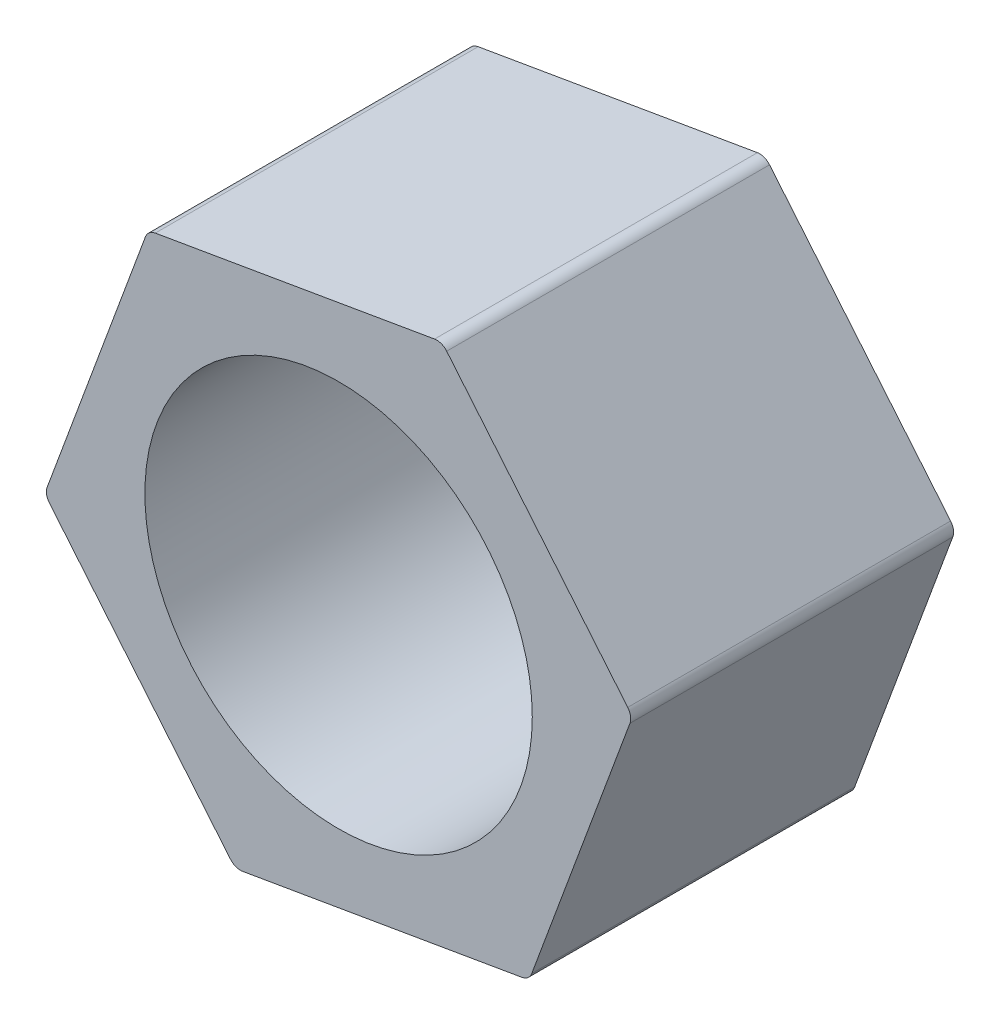
ISO-10303-21;
HEADER;
FILE_DESCRIPTION(('STEP AP214'),'2;1');
FILE_NAME('part.step','',(''),(''),'','','');
FILE_SCHEMA(('AUTOMOTIVE_DESIGN { 1 0 10303 214 1 1 1 1 }'));
ENDSEC;
DATA;
#1=APPLICATION_CONTEXT('core data for automotive mechanical design processes');
#2=APPLICATION_PROTOCOL_DEFINITION('international standard','automotive_design',2000,#1);
#3=PRODUCT_CONTEXT('',#1,'mechanical');
#4=PRODUCT('Part','Part','',(#3));
#5=PRODUCT_RELATED_PRODUCT_CATEGORY('part','',(#4));
#6=PRODUCT_DEFINITION_FORMATION('','',#4);
#7=PRODUCT_DEFINITION_CONTEXT('part definition',#1,'design');
#8=PRODUCT_DEFINITION('design','',#6,#7);
#9=PRODUCT_DEFINITION_SHAPE('','',#8);
#10=(LENGTH_UNIT() NAMED_UNIT(*) SI_UNIT(.MILLI.,.METRE.));
#11=(NAMED_UNIT(*) PLANE_ANGLE_UNIT() SI_UNIT($,.RADIAN.));
#12=(NAMED_UNIT(*) SI_UNIT($,.STERADIAN.) SOLID_ANGLE_UNIT());
#13=UNCERTAINTY_MEASURE_WITH_UNIT(LENGTH_MEASURE(1.E-05),#10,'distance_accuracy_value','');
#14=(GEOMETRIC_REPRESENTATION_CONTEXT(3) GLOBAL_UNCERTAINTY_ASSIGNED_CONTEXT((#13)) GLOBAL_UNIT_ASSIGNED_CONTEXT((#10,
#11,#12)) REPRESENTATION_CONTEXT('',''));
#15=CARTESIAN_POINT('',(0.,0.,0.));
#16=DIRECTION('',(0.,0.,1.));
#17=DIRECTION('',(1.,0.,0.));
#18=AXIS2_PLACEMENT_3D('',#15,#16,#17);
#19=CARTESIAN_POINT('',(44.7204554434842,4.11601124606248,5.));
#20=DIRECTION('',(0.,0.,1.));
#21=DIRECTION('',(1.,0.,0.));
#22=AXIS2_PLACEMENT_3D('',#19,#20,#21);
#23=PLANE('',#22);
#24=CARTESIAN_POINT('',(44.7204554434842,4.11601124606248,5.));
#25=DIRECTION('',(0.,0.,1.));
#26=DIRECTION('',(1.,0.,0.));
#27=AXIS2_PLACEMENT_3D('',#24,#25,#26);
#28=CIRCLE('',#27,0.2);
#29=CARTESIAN_POINT('',(44.874277903131,4.24383397842337,5.));
#30=VERTEX_POINT('',#29);
#31=CARTESIAN_POINT('',(44.6866689399019,4.31313676996967,5.));
#32=VERTEX_POINT('',#31);
#33=EDGE_CURVE('E221',#30,#32,#28,.T.);
#34=ORIENTED_EDGE('',*,*,#33,.T.);
#35=DIRECTION('',(-0.985627619535963,-0.168932517911357,0.));
#36=VECTOR('',#35,1.);
#37=CARTESIAN_POINT('',(44.6866689399019,4.31313676996967,5.));
#38=LINE('',#37,#36);
#39=CARTESIAN_POINT('',(40.3618709168073,3.57188418631805,5.));
#40=VERTEX_POINT('',#39);
#41=EDGE_CURVE('E148',#32,#40,#38,.T.);
#42=ORIENTED_EDGE('',*,*,#41,.T.);
#43=CARTESIAN_POINT('',(40.3956574203896,3.37475866241085,5.));
#44=DIRECTION('',(0.,0.,1.));
#45=DIRECTION('',(1.,0.,0.));
#46=AXIS2_PLACEMENT_3D('',#43,#44,#45);
#47=CIRCLE('',#46,0.199999999999998);
#48=CARTESIAN_POINT('',(40.2080484571605,3.44406145395715,5.));
#49=VERTEX_POINT('',#48);
#50=EDGE_CURVE('E247',#40,#49,#47,.T.);
#51=ORIENTED_EDGE('',*,*,#50,.T.);
#52=DIRECTION('',(-0.346513957731477,-0.938044816145405,0.));
#53=VECTOR('',#52,1.);
#54=CARTESIAN_POINT('',(40.2080484571605,3.44406145395715,5.));
#55=LINE('',#54,#53);
#56=CARTESIAN_POINT('',(38.6875930136763,-0.671949792105319,5.));
#57=VERTEX_POINT('',#56);
#58=EDGE_CURVE('E266',#49,#57,#55,.T.);
#59=ORIENTED_EDGE('',*,*,#58,.T.);
#60=CARTESIAN_POINT('',(38.8752019769054,-0.741252583651616,5.));
#61=DIRECTION('',(0.,0.,1.));
#62=DIRECTION('',(1.,0.,0.));
#63=AXIS2_PLACEMENT_3D('',#60,#61,#62);
#64=CIRCLE('',#63,0.199999999999997);
#65=CARTESIAN_POINT('',(38.7213795172586,-0.869075316012514,5.));
#66=VERTEX_POINT('',#65);
#67=EDGE_CURVE('E263',#57,#66,#64,.T.);
#68=ORIENTED_EDGE('',*,*,#67,.T.);
#69=DIRECTION('',(0.639113661804485,-0.76911229823405,0.));
#70=VECTOR('',#69,1.);
#71=CARTESIAN_POINT('',(38.7213795172586,-0.869075316012514,5.));
#72=LINE('',#71,#70);
#73=CARTESIAN_POINT('',(41.5257220968691,-4.24383397842339,5.));
#74=VERTEX_POINT('',#73);
#75=EDGE_CURVE('E265',#66,#74,#72,.T.);
#76=ORIENTED_EDGE('',*,*,#75,.T.);
#77=CARTESIAN_POINT('',(41.6795445565159,-4.1160112460625,5.));
#78=DIRECTION('',(0.,0.,1.));
#79=DIRECTION('',(1.,0.,0.));
#80=AXIS2_PLACEMENT_3D('',#77,#78,#79);
#81=CIRCLE('',#80,0.2);
#82=CARTESIAN_POINT('',(41.7133310600982,-4.31313676996969,5.));
#83=VERTEX_POINT('',#82);
#84=EDGE_CURVE('E268',#74,#83,#81,.T.);
#85=ORIENTED_EDGE('',*,*,#84,.T.);
#86=DIRECTION('',(0.985627619535963,0.168932517911357,0.));
#87=VECTOR('',#86,1.);
#88=CARTESIAN_POINT('',(41.7133310600982,-4.31313676996969,5.));
#89=LINE('',#88,#87);
#90=CARTESIAN_POINT('',(46.0381290831928,-3.57188418631807,5.));
#91=VERTEX_POINT('',#90);
#92=EDGE_CURVE('E274',#83,#91,#89,.T.);
#93=ORIENTED_EDGE('',*,*,#92,.T.);
#94=CARTESIAN_POINT('',(46.0043425796105,-3.37475866241088,5.));
#95=DIRECTION('',(0.,0.,-1.));
#96=DIRECTION('',(-1.,0.,0.));
#97=AXIS2_PLACEMENT_3D('',#94,#95,#96);
#98=CIRCLE('',#97,0.199999999999998);
#99=CARTESIAN_POINT('',(46.1919515428396,-3.44406145395717,5.));
#100=VERTEX_POINT('',#99);
#101=EDGE_CURVE('E180',#100,#91,#98,.T.);
#102=ORIENTED_EDGE('',*,*,#101,.F.);
#103=DIRECTION('',(0.346513957731476,0.938044816145406,0.));
#104=VECTOR('',#103,1.);
#105=CARTESIAN_POINT('',(46.1919515428396,-3.44406145395717,5.));
#106=LINE('',#105,#104);
#107=CARTESIAN_POINT('',(47.7124069863237,0.671949792105321,5.));
#108=VERTEX_POINT('',#107);
#109=EDGE_CURVE('E174',#100,#108,#106,.T.);
#110=ORIENTED_EDGE('',*,*,#109,.T.);
#111=CARTESIAN_POINT('',(47.5247980230947,0.741252583651617,5.));
#112=DIRECTION('',(0.,0.,1.));
#113=DIRECTION('',(1.,0.,0.));
#114=AXIS2_PLACEMENT_3D('',#111,#112,#113);
#115=CIRCLE('',#114,0.199999999999997);
#116=CARTESIAN_POINT('',(47.6786204827415,0.869075316012516,5.));
#117=VERTEX_POINT('',#116);
#118=EDGE_CURVE('E178',#108,#117,#115,.T.);
#119=ORIENTED_EDGE('',*,*,#118,.T.);
#120=DIRECTION('',(-0.639113661804485,0.76911229823405,0.));
#121=VECTOR('',#120,1.);
#122=CARTESIAN_POINT('',(47.6786204827415,0.869075316012515,5.));
#123=LINE('',#122,#121);
#124=EDGE_CURVE('E93',#117,#30,#123,.T.);
#125=ORIENTED_EDGE('',*,*,#124,.T.);
#126=EDGE_LOOP('',(#34,#42,#51,#59,#68,#76,#85,#93,#102,#110,#119,#125));
#127=FACE_BOUND('',#126,.T.);
#128=CARTESIAN_POINT('',(43.2,0.,5.));
#129=DIRECTION('',(0.,0.,1.));
#130=DIRECTION('',(1.,0.,0.));
#131=AXIS2_PLACEMENT_3D('',#128,#129,#130);
#132=CIRCLE('',#131,3.);
#133=CARTESIAN_POINT('',(46.2,0.,5.));
#134=VERTEX_POINT('',#133);
#135=EDGE_CURVE('E200',#134,#134,#132,.T.);
#136=ORIENTED_EDGE('',*,*,#135,.F.);
#137=EDGE_LOOP('',(#136));
#138=FACE_BOUND('',#137,.T.);
#139=ADVANCED_FACE('F76',(#127,#138),#23,.T.);
#140=CARTESIAN_POINT('',(44.7204554434842,4.11601124606248,0.));
#141=DIRECTION('',(0.,0.,1.));
#142=DIRECTION('',(1.,0.,0.));
#143=AXIS2_PLACEMENT_3D('',#140,#141,#142);
#144=PLANE('',#143);
#145=CARTESIAN_POINT('',(44.7204554434842,4.11601124606248,0.));
#146=DIRECTION('',(0.,0.,1.));
#147=DIRECTION('',(1.,0.,0.));
#148=AXIS2_PLACEMENT_3D('',#145,#146,#147);
#149=CIRCLE('',#148,0.2);
#150=CARTESIAN_POINT('',(44.874277903131,4.24383397842337,0.));
#151=VERTEX_POINT('',#150);
#152=CARTESIAN_POINT('',(44.6866689399019,4.31313676996967,0.));
#153=VERTEX_POINT('',#152);
#154=EDGE_CURVE('E196',#151,#153,#149,.T.);
#155=ORIENTED_EDGE('',*,*,#154,.F.);
#156=DIRECTION('',(-0.639113661804485,0.76911229823405,0.));
#157=VECTOR('',#156,1.);
#158=CARTESIAN_POINT('',(47.6786204827415,0.869075316012515,0.));
#159=LINE('',#158,#157);
#160=CARTESIAN_POINT('',(47.6786204827415,0.869075316012516,0.));
#161=VERTEX_POINT('',#160);
#162=EDGE_CURVE('E140',#161,#151,#159,.T.);
#163=ORIENTED_EDGE('',*,*,#162,.F.);
#164=CARTESIAN_POINT('',(47.5247980230947,0.741252583651617,0.));
#165=DIRECTION('',(0.,0.,1.));
#166=DIRECTION('',(1.,0.,0.));
#167=AXIS2_PLACEMENT_3D('',#164,#165,#166);
#168=CIRCLE('',#167,0.199999999999997);
#169=CARTESIAN_POINT('',(47.7124069863237,0.671949792105321,0.));
#170=VERTEX_POINT('',#169);
#171=EDGE_CURVE('E134',#170,#161,#168,.T.);
#172=ORIENTED_EDGE('',*,*,#171,.F.);
#173=DIRECTION('',(0.346513957731476,0.938044816145406,0.));
#174=VECTOR('',#173,1.);
#175=CARTESIAN_POINT('',(46.1919515428396,-3.44406145395717,0.));
#176=LINE('',#175,#174);
#177=CARTESIAN_POINT('',(46.1919515428396,-3.44406145395717,0.));
#178=VERTEX_POINT('',#177);
#179=EDGE_CURVE('E186',#178,#170,#176,.T.);
#180=ORIENTED_EDGE('',*,*,#179,.F.);
#181=CARTESIAN_POINT('',(46.0043425796105,-3.37475866241088,0.));
#182=DIRECTION('',(0.,0.,-1.));
#183=DIRECTION('',(-1.,0.,0.));
#184=AXIS2_PLACEMENT_3D('',#181,#182,#183);
#185=CIRCLE('',#184,0.199999999999998);
#186=CARTESIAN_POINT('',(46.0381290831928,-3.57188418631807,0.));
#187=VERTEX_POINT('',#186);
#188=EDGE_CURVE('E215',#178,#187,#185,.T.);
#189=ORIENTED_EDGE('',*,*,#188,.T.);
#190=DIRECTION('',(0.985627619535963,0.168932517911357,0.));
#191=VECTOR('',#190,1.);
#192=CARTESIAN_POINT('',(41.7133310600982,-4.31313676996969,0.));
#193=LINE('',#192,#191);
#194=CARTESIAN_POINT('',(41.7133310600982,-4.31313676996969,0.));
#195=VERTEX_POINT('',#194);
#196=EDGE_CURVE('E212',#195,#187,#193,.T.);
#197=ORIENTED_EDGE('',*,*,#196,.F.);
#198=CARTESIAN_POINT('',(41.6795445565159,-4.1160112460625,0.));
#199=DIRECTION('',(0.,0.,1.));
#200=DIRECTION('',(1.,0.,0.));
#201=AXIS2_PLACEMENT_3D('',#198,#199,#200);
#202=CIRCLE('',#201,0.2);
#203=CARTESIAN_POINT('',(41.5257220968691,-4.24383397842339,0.));
#204=VERTEX_POINT('',#203);
#205=EDGE_CURVE('E210',#204,#195,#202,.T.);
#206=ORIENTED_EDGE('',*,*,#205,.F.);
#207=DIRECTION('',(0.639113661804485,-0.76911229823405,0.));
#208=VECTOR('',#207,1.);
#209=CARTESIAN_POINT('',(38.7213795172586,-0.869075316012514,0.));
#210=LINE('',#209,#208);
#211=CARTESIAN_POINT('',(38.7213795172586,-0.869075316012514,0.));
#212=VERTEX_POINT('',#211);
#213=EDGE_CURVE('E208',#212,#204,#210,.T.);
#214=ORIENTED_EDGE('',*,*,#213,.F.);
#215=CARTESIAN_POINT('',(38.8752019769054,-0.741252583651616,0.));
#216=DIRECTION('',(0.,0.,1.));
#217=DIRECTION('',(1.,0.,0.));
#218=AXIS2_PLACEMENT_3D('',#215,#216,#217);
#219=CIRCLE('',#218,0.199999999999997);
#220=CARTESIAN_POINT('',(38.6875930136763,-0.671949792105319,0.));
#221=VERTEX_POINT('',#220);
#222=EDGE_CURVE('E206',#221,#212,#219,.T.);
#223=ORIENTED_EDGE('',*,*,#222,.F.);
#224=DIRECTION('',(-0.346513957731477,-0.938044816145405,0.));
#225=VECTOR('',#224,1.);
#226=CARTESIAN_POINT('',(40.2080484571605,3.44406145395715,0.));
#227=LINE('',#226,#225);
#228=CARTESIAN_POINT('',(40.2080484571605,3.44406145395715,0.));
#229=VERTEX_POINT('',#228);
#230=EDGE_CURVE('E204',#229,#221,#227,.T.);
#231=ORIENTED_EDGE('',*,*,#230,.F.);
#232=CARTESIAN_POINT('',(40.3956574203896,3.37475866241085,0.));
#233=DIRECTION('',(0.,0.,1.));
#234=DIRECTION('',(1.,0.,0.));
#235=AXIS2_PLACEMENT_3D('',#232,#233,#234);
#236=CIRCLE('',#235,0.199999999999998);
#237=CARTESIAN_POINT('',(40.3618709168073,3.57188418631805,0.));
#238=VERTEX_POINT('',#237);
#239=EDGE_CURVE('E202',#238,#229,#236,.T.);
#240=ORIENTED_EDGE('',*,*,#239,.F.);
#241=DIRECTION('',(-0.985627619535963,-0.168932517911357,0.));
#242=VECTOR('',#241,1.);
#243=CARTESIAN_POINT('',(44.6866689399019,4.31313676996967,0.));
#244=LINE('',#243,#242);
#245=EDGE_CURVE('E199',#153,#238,#244,.T.);
#246=ORIENTED_EDGE('',*,*,#245,.F.);
#247=EDGE_LOOP('',(#155,#163,#172,#180,#189,#197,#206,#214,#223,#231,#240,#246));
#248=FACE_BOUND('',#247,.T.);
#249=CARTESIAN_POINT('',(43.2,0.,0.));
#250=DIRECTION('',(0.,0.,1.));
#251=DIRECTION('',(1.,0.,0.));
#252=AXIS2_PLACEMENT_3D('',#249,#250,#251);
#253=CIRCLE('',#252,3.);
#254=CARTESIAN_POINT('',(46.2,0.,0.));
#255=VERTEX_POINT('',#254);
#256=EDGE_CURVE('E451',#255,#255,#253,.T.);
#257=ORIENTED_EDGE('',*,*,#256,.T.);
#258=EDGE_LOOP('',(#257));
#259=FACE_BOUND('',#258,.T.);
#260=ADVANCED_FACE('F251',(#248,#259),#144,.F.);
#261=CARTESIAN_POINT('',(44.7204554434842,4.11601124606248,5.));
#262=DIRECTION('',(0.,0.,-1.));
#263=DIRECTION('',(-1.,0.,0.));
#264=AXIS2_PLACEMENT_3D('',#261,#262,#263);
#265=CYLINDRICAL_SURFACE('',#264,0.2);
#266=ORIENTED_EDGE('',*,*,#154,.T.);
#267=DIRECTION('',(0.,0.,-1.));
#268=VECTOR('',#267,1.);
#269=CARTESIAN_POINT('',(44.6866689399019,4.31313676996967,5.));
#270=LINE('',#269,#268);
#271=EDGE_CURVE('E12',#32,#153,#270,.T.);
#272=ORIENTED_EDGE('',*,*,#271,.F.);
#273=ORIENTED_EDGE('',*,*,#33,.F.);
#274=DIRECTION('',(0.,0.,-1.));
#275=VECTOR('',#274,1.);
#276=CARTESIAN_POINT('',(44.874277903131,4.24383397842337,5.));
#277=LINE('',#276,#275);
#278=EDGE_CURVE('E192',#30,#151,#277,.T.);
#279=ORIENTED_EDGE('',*,*,#278,.T.);
#280=EDGE_LOOP('',(#266,#272,#273,#279));
#281=FACE_BOUND('',#280,.T.);
#282=ADVANCED_FACE('F78',(#281),#265,.T.);
#283=CARTESIAN_POINT('',(44.6866689399019,4.31313676996967,5.));
#284=DIRECTION('',(0.168932517911357,-0.985627619535963,0.));
#285=DIRECTION('',(0.985627619535963,0.168932517911357,0.));
#286=AXIS2_PLACEMENT_3D('',#283,#284,#285);
#287=PLANE('',#286);
#288=ORIENTED_EDGE('',*,*,#245,.T.);
#289=DIRECTION('',(0.,0.,-1.));
#290=VECTOR('',#289,1.);
#291=CARTESIAN_POINT('',(40.3618709168073,3.57188418631805,5.));
#292=LINE('',#291,#290);
#293=EDGE_CURVE('E85',#40,#238,#292,.T.);
#294=ORIENTED_EDGE('',*,*,#293,.F.);
#295=ORIENTED_EDGE('',*,*,#41,.F.);
#296=ORIENTED_EDGE('',*,*,#271,.T.);
#297=EDGE_LOOP('',(#288,#294,#295,#296));
#298=FACE_BOUND('',#297,.T.);
#299=ADVANCED_FACE('F303',(#298),#287,.F.);
#300=CARTESIAN_POINT('',(40.3956574203896,3.37475866241085,5.));
#301=DIRECTION('',(0.,0.,-1.));
#302=DIRECTION('',(-1.,0.,0.));
#303=AXIS2_PLACEMENT_3D('',#300,#301,#302);
#304=CYLINDRICAL_SURFACE('',#303,0.199999999999998);
#305=ORIENTED_EDGE('',*,*,#239,.T.);
#306=DIRECTION('',(0.,0.,-1.));
#307=VECTOR('',#306,1.);
#308=CARTESIAN_POINT('',(40.2080484571605,3.44406145395715,5.));
#309=LINE('',#308,#307);
#310=EDGE_CURVE('E239',#49,#229,#309,.T.);
#311=ORIENTED_EDGE('',*,*,#310,.F.);
#312=ORIENTED_EDGE('',*,*,#50,.F.);
#313=ORIENTED_EDGE('',*,*,#293,.T.);
#314=EDGE_LOOP('',(#305,#311,#312,#313));
#315=FACE_BOUND('',#314,.T.);
#316=ADVANCED_FACE('F245',(#315),#304,.T.);
#317=CARTESIAN_POINT('',(40.2080484571605,3.44406145395715,5.));
#318=DIRECTION('',(0.938044816145406,-0.346513957731478,0.));
#319=DIRECTION('',(0.346513957731478,0.938044816145406,0.));
#320=AXIS2_PLACEMENT_3D('',#317,#318,#319);
#321=PLANE('',#320);
#322=ORIENTED_EDGE('',*,*,#230,.T.);
#323=DIRECTION('',(0.,0.,-1.));
#324=VECTOR('',#323,1.);
#325=CARTESIAN_POINT('',(38.6875930136763,-0.671949792105319,5.));
#326=LINE('',#325,#324);
#327=EDGE_CURVE('E236',#57,#221,#326,.T.);
#328=ORIENTED_EDGE('',*,*,#327,.F.);
#329=ORIENTED_EDGE('',*,*,#58,.F.);
#330=ORIENTED_EDGE('',*,*,#310,.T.);
#331=EDGE_LOOP('',(#322,#328,#329,#330));
#332=FACE_BOUND('',#331,.T.);
#333=ADVANCED_FACE('F257',(#332),#321,.F.);
#334=CARTESIAN_POINT('',(38.8752019769054,-0.741252583651616,5.));
#335=DIRECTION('',(0.,0.,-1.));
#336=DIRECTION('',(-1.,0.,0.));
#337=AXIS2_PLACEMENT_3D('',#334,#335,#336);
#338=CYLINDRICAL_SURFACE('',#337,0.199999999999997);
#339=ORIENTED_EDGE('',*,*,#222,.T.);
#340=DIRECTION('',(0.,0.,-1.));
#341=VECTOR('',#340,1.);
#342=CARTESIAN_POINT('',(38.7213795172586,-0.869075316012514,5.));
#343=LINE('',#342,#341);
#344=EDGE_CURVE('E233',#66,#212,#343,.T.);
#345=ORIENTED_EDGE('',*,*,#344,.F.);
#346=ORIENTED_EDGE('',*,*,#67,.F.);
#347=ORIENTED_EDGE('',*,*,#327,.T.);
#348=EDGE_LOOP('',(#339,#345,#346,#347));
#349=FACE_BOUND('',#348,.T.);
#350=ADVANCED_FACE('F261',(#349),#338,.T.);
#351=CARTESIAN_POINT('',(38.7213795172586,-0.869075316012514,5.));
#352=DIRECTION('',(0.76911229823405,0.639113661804485,0.));
#353=DIRECTION('',(-0.639113661804485,0.76911229823405,0.));
#354=AXIS2_PLACEMENT_3D('',#351,#352,#353);
#355=PLANE('',#354);
#356=ORIENTED_EDGE('',*,*,#213,.T.);
#357=DIRECTION('',(0.,0.,-1.));
#358=VECTOR('',#357,1.);
#359=CARTESIAN_POINT('',(41.5257220968691,-4.24383397842339,5.));
#360=LINE('',#359,#358);
#361=EDGE_CURVE('E230',#74,#204,#360,.T.);
#362=ORIENTED_EDGE('',*,*,#361,.F.);
#363=ORIENTED_EDGE('',*,*,#75,.F.);
#364=ORIENTED_EDGE('',*,*,#344,.T.);
#365=EDGE_LOOP('',(#356,#362,#363,#364));
#366=FACE_BOUND('',#365,.T.);
#367=ADVANCED_FACE('F316',(#366),#355,.F.);
#368=CARTESIAN_POINT('',(41.6795445565159,-4.1160112460625,5.));
#369=DIRECTION('',(0.,0.,-1.));
#370=DIRECTION('',(-1.,0.,0.));
#371=AXIS2_PLACEMENT_3D('',#368,#369,#370);
#372=CYLINDRICAL_SURFACE('',#371,0.2);
#373=ORIENTED_EDGE('',*,*,#205,.T.);
#374=DIRECTION('',(0.,0.,-1.));
#375=VECTOR('',#374,1.);
#376=CARTESIAN_POINT('',(41.7133310600982,-4.31313676996969,5.));
#377=LINE('',#376,#375);
#378=EDGE_CURVE('E227',#83,#195,#377,.T.);
#379=ORIENTED_EDGE('',*,*,#378,.F.);
#380=ORIENTED_EDGE('',*,*,#84,.F.);
#381=ORIENTED_EDGE('',*,*,#361,.T.);
#382=EDGE_LOOP('',(#373,#379,#380,#381));
#383=FACE_BOUND('',#382,.T.);
#384=ADVANCED_FACE('F319',(#383),#372,.T.);
#385=CARTESIAN_POINT('',(41.7133310600982,-4.31313676996969,5.));
#386=DIRECTION('',(-0.168932517911357,0.985627619535963,0.));
#387=DIRECTION('',(-0.985627619535963,-0.168932517911357,0.));
#388=AXIS2_PLACEMENT_3D('',#385,#386,#387);
#389=PLANE('',#388);
#390=ORIENTED_EDGE('',*,*,#196,.T.);
#391=DIRECTION('',(0.,0.,-1.));
#392=VECTOR('',#391,1.);
#393=CARTESIAN_POINT('',(46.0381290831928,-3.57188418631807,5.));
#394=LINE('',#393,#392);
#395=EDGE_CURVE('E225',#91,#187,#394,.T.);
#396=ORIENTED_EDGE('',*,*,#395,.F.);
#397=ORIENTED_EDGE('',*,*,#92,.F.);
#398=ORIENTED_EDGE('',*,*,#378,.T.);
#399=EDGE_LOOP('',(#390,#396,#397,#398));
#400=FACE_BOUND('',#399,.T.);
#401=ADVANCED_FACE('F323',(#400),#389,.F.);
#402=CARTESIAN_POINT('',(46.0043425796105,-3.37475866241088,5.));
#403=DIRECTION('',(0.,0.,-1.));
#404=DIRECTION('',(-1.,0.,0.));
#405=AXIS2_PLACEMENT_3D('',#402,#403,#404);
#406=CYLINDRICAL_SURFACE('',#405,0.199999999999998);
#407=ORIENTED_EDGE('',*,*,#188,.F.);
#408=DIRECTION('',(0.,0.,-1.));
#409=VECTOR('',#408,1.);
#410=CARTESIAN_POINT('',(46.1919515428396,-3.44406145395717,5.));
#411=LINE('',#410,#409);
#412=EDGE_CURVE('E187',#100,#178,#411,.T.);
#413=ORIENTED_EDGE('',*,*,#412,.F.);
#414=ORIENTED_EDGE('',*,*,#101,.T.);
#415=ORIENTED_EDGE('',*,*,#395,.T.);
#416=EDGE_LOOP('',(#407,#413,#414,#415));
#417=FACE_BOUND('',#416,.T.);
#418=ADVANCED_FACE('F277',(#417),#406,.T.);
#419=CARTESIAN_POINT('',(46.1919515428396,-3.44406145395717,5.));
#420=DIRECTION('',(-0.938044816145406,0.346513957731476,0.));
#421=DIRECTION('',(-0.346513957731476,-0.938044816145406,0.));
#422=AXIS2_PLACEMENT_3D('',#419,#420,#421);
#423=PLANE('',#422);
#424=ORIENTED_EDGE('',*,*,#179,.T.);
#425=DIRECTION('',(0.,0.,-1.));
#426=VECTOR('',#425,1.);
#427=CARTESIAN_POINT('',(47.7124069863237,0.671949792105321,5.));
#428=LINE('',#427,#426);
#429=EDGE_CURVE('E183',#108,#170,#428,.T.);
#430=ORIENTED_EDGE('',*,*,#429,.F.);
#431=ORIENTED_EDGE('',*,*,#109,.F.);
#432=ORIENTED_EDGE('',*,*,#412,.T.);
#433=EDGE_LOOP('',(#424,#430,#431,#432));
#434=FACE_BOUND('',#433,.T.);
#435=ADVANCED_FACE('F184',(#434),#423,.F.);
#436=CARTESIAN_POINT('',(47.5247980230947,0.741252583651617,5.));
#437=DIRECTION('',(0.,0.,-1.));
#438=DIRECTION('',(-1.,0.,0.));
#439=AXIS2_PLACEMENT_3D('',#436,#437,#438);
#440=CYLINDRICAL_SURFACE('',#439,0.199999999999997);
#441=ORIENTED_EDGE('',*,*,#171,.T.);
#442=DIRECTION('',(0.,0.,-1.));
#443=VECTOR('',#442,1.);
#444=CARTESIAN_POINT('',(47.6786204827415,0.869075316012516,5.));
#445=LINE('',#444,#443);
#446=EDGE_CURVE('E188',#117,#161,#445,.T.);
#447=ORIENTED_EDGE('',*,*,#446,.F.);
#448=ORIENTED_EDGE('',*,*,#118,.F.);
#449=ORIENTED_EDGE('',*,*,#429,.T.);
#450=EDGE_LOOP('',(#441,#447,#448,#449));
#451=FACE_BOUND('',#450,.T.);
#452=ADVANCED_FACE('F190',(#451),#440,.T.);
#453=CARTESIAN_POINT('',(47.6786204827415,0.869075316012515,5.));
#454=DIRECTION('',(-0.76911229823405,-0.639113661804485,0.));
#455=DIRECTION('',(0.639113661804485,-0.76911229823405,0.));
#456=AXIS2_PLACEMENT_3D('',#453,#454,#455);
#457=PLANE('',#456);
#458=ORIENTED_EDGE('',*,*,#162,.T.);
#459=ORIENTED_EDGE('',*,*,#278,.F.);
#460=ORIENTED_EDGE('',*,*,#124,.F.);
#461=ORIENTED_EDGE('',*,*,#446,.T.);
#462=EDGE_LOOP('',(#458,#459,#460,#461));
#463=FACE_BOUND('',#462,.T.);
#464=ADVANCED_FACE('F283',(#463),#457,.F.);
#465=CARTESIAN_POINT('',(43.2,0.,5.));
#466=DIRECTION('',(0.,0.,-1.));
#467=DIRECTION('',(-1.,0.,0.));
#468=AXIS2_PLACEMENT_3D('',#465,#466,#467);
#469=CYLINDRICAL_SURFACE('',#468,3.);
#470=ORIENTED_EDGE('',*,*,#135,.T.);
#471=EDGE_LOOP('',(#470));
#472=FACE_BOUND('',#471,.T.);
#473=ORIENTED_EDGE('',*,*,#256,.F.);
#474=EDGE_LOOP('',(#473));
#475=FACE_BOUND('',#474,.T.);
#476=ADVANCED_FACE('F285',(#472,#475),#469,.F.);
#477=CLOSED_SHELL('',(#139,#260,#282,#299,#316,#333,#350,#367,#384,#401,#418,#435,#452,#464,#476));
#478=MANIFOLD_SOLID_BREP('B2',#477);
#479=ADVANCED_BREP_SHAPE_REPRESENTATION('',(#18,#478),#14);
#480=SHAPE_DEFINITION_REPRESENTATION(#9,#479);
ENDSEC;
END-ISO-10303-21;
